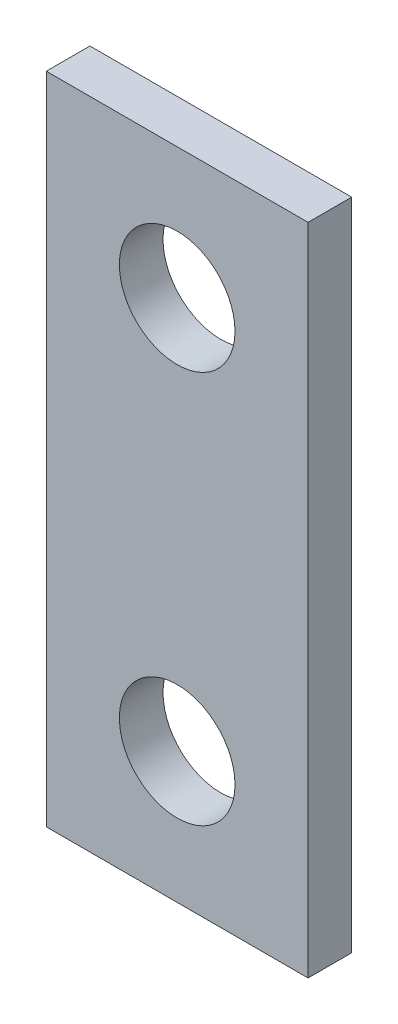
ISO-10303-21;
HEADER;
FILE_DESCRIPTION(('STEP AP214'),'2;1');
FILE_NAME('part.step','',(''),(''),'','','');
FILE_SCHEMA(('AUTOMOTIVE_DESIGN { 1 0 10303 214 1 1 1 1 }'));
ENDSEC;
DATA;
#1=APPLICATION_CONTEXT('core data for automotive mechanical design processes');
#2=APPLICATION_PROTOCOL_DEFINITION('international standard','automotive_design',2000,#1);
#3=PRODUCT_CONTEXT('',#1,'mechanical');
#4=PRODUCT('Part','Part','',(#3));
#5=PRODUCT_RELATED_PRODUCT_CATEGORY('part','',(#4));
#6=PRODUCT_DEFINITION_FORMATION('','',#4);
#7=PRODUCT_DEFINITION_CONTEXT('part definition',#1,'design');
#8=PRODUCT_DEFINITION('design','',#6,#7);
#9=PRODUCT_DEFINITION_SHAPE('','',#8);
#10=(LENGTH_UNIT() NAMED_UNIT(*) SI_UNIT(.MILLI.,.METRE.));
#11=(NAMED_UNIT(*) PLANE_ANGLE_UNIT() SI_UNIT($,.RADIAN.));
#12=(NAMED_UNIT(*) SI_UNIT($,.STERADIAN.) SOLID_ANGLE_UNIT());
#13=UNCERTAINTY_MEASURE_WITH_UNIT(LENGTH_MEASURE(1.E-05),#10,'distance_accuracy_value','');
#14=(GEOMETRIC_REPRESENTATION_CONTEXT(3) GLOBAL_UNCERTAINTY_ASSIGNED_CONTEXT((#13)) GLOBAL_UNIT_ASSIGNED_CONTEXT((#10,
#11,#12)) REPRESENTATION_CONTEXT('',''));
#15=CARTESIAN_POINT('',(0.,0.,0.));
#16=DIRECTION('',(0.,0.,1.));
#17=DIRECTION('',(1.,0.,0.));
#18=AXIS2_PLACEMENT_3D('',#15,#16,#17);
#19=CARTESIAN_POINT('',(5.99999999999999,-15.,1.99999999999995));
#20=DIRECTION('',(-1.,0.,0.));
#21=DIRECTION('',(0.,0.,1.));
#22=AXIS2_PLACEMENT_3D('',#19,#20,#21);
#23=PLANE('',#22);
#24=DIRECTION('',(0.,1.,0.));
#25=VECTOR('',#24,1.);
#26=CARTESIAN_POINT('',(5.99999999999999,-15.,0.));
#27=LINE('',#26,#25);
#28=CARTESIAN_POINT('',(5.99999999999999,-15.,0.));
#29=VERTEX_POINT('',#28);
#30=CARTESIAN_POINT('',(5.99999999999999,15.,0.));
#31=VERTEX_POINT('',#30);
#32=EDGE_CURVE('E121',#29,#31,#27,.T.);
#33=ORIENTED_EDGE('',*,*,#32,.T.);
#34=DIRECTION('',(0.,0.,-1.));
#35=VECTOR('',#34,1.);
#36=CARTESIAN_POINT('',(5.99999999999999,15.,1.99999999999995));
#37=LINE('',#36,#35);
#38=CARTESIAN_POINT('',(5.99999999999999,15.,1.99999999999995));
#39=VERTEX_POINT('',#38);
#40=EDGE_CURVE('E11',#39,#31,#37,.T.);
#41=ORIENTED_EDGE('',*,*,#40,.F.);
#42=DIRECTION('',(0.,1.,0.));
#43=VECTOR('',#42,1.);
#44=CARTESIAN_POINT('',(5.99999999999999,-15.,1.99999999999995));
#45=LINE('',#44,#43);
#46=CARTESIAN_POINT('',(5.99999999999999,-15.,1.99999999999995));
#47=VERTEX_POINT('',#46);
#48=EDGE_CURVE('E104',#47,#39,#45,.T.);
#49=ORIENTED_EDGE('',*,*,#48,.F.);
#50=DIRECTION('',(0.,0.,-1.));
#51=VECTOR('',#50,1.);
#52=CARTESIAN_POINT('',(5.99999999999999,-15.,1.99999999999995));
#53=LINE('',#52,#51);
#54=EDGE_CURVE('E117',#47,#29,#53,.T.);
#55=ORIENTED_EDGE('',*,*,#54,.T.);
#56=EDGE_LOOP('',(#33,#41,#49,#55));
#57=FACE_BOUND('',#56,.T.);
#58=ADVANCED_FACE('F44',(#57),#23,.F.);
#59=CARTESIAN_POINT('',(-6.00000000000001,15.,1.99999999999995));
#60=DIRECTION('',(0.,-1.,0.));
#61=DIRECTION('',(0.,0.,-1.));
#62=AXIS2_PLACEMENT_3D('',#59,#60,#61);
#63=PLANE('',#62);
#64=DIRECTION('',(-1.,0.,0.));
#65=VECTOR('',#64,1.);
#66=CARTESIAN_POINT('',(-6.00000000000001,15.,0.));
#67=LINE('',#66,#65);
#68=CARTESIAN_POINT('',(-6.00000000000001,15.,0.));
#69=VERTEX_POINT('',#68);
#70=EDGE_CURVE('E109',#31,#69,#67,.T.);
#71=ORIENTED_EDGE('',*,*,#70,.T.);
#72=DIRECTION('',(0.,0.,-1.));
#73=VECTOR('',#72,1.);
#74=CARTESIAN_POINT('',(-6.00000000000001,15.,1.99999999999995));
#75=LINE('',#74,#73);
#76=CARTESIAN_POINT('',(-6.00000000000001,15.,1.99999999999995));
#77=VERTEX_POINT('',#76);
#78=EDGE_CURVE('E53',#77,#69,#75,.T.);
#79=ORIENTED_EDGE('',*,*,#78,.F.);
#80=DIRECTION('',(-1.,0.,0.));
#81=VECTOR('',#80,1.);
#82=CARTESIAN_POINT('',(-6.00000000000001,15.,1.99999999999995));
#83=LINE('',#82,#81);
#84=EDGE_CURVE('E99',#39,#77,#83,.T.);
#85=ORIENTED_EDGE('',*,*,#84,.F.);
#86=ORIENTED_EDGE('',*,*,#40,.T.);
#87=EDGE_LOOP('',(#71,#79,#85,#86));
#88=FACE_BOUND('',#87,.T.);
#89=ADVANCED_FACE('F108',(#88),#63,.F.);
#90=CARTESIAN_POINT('',(-6.,-15.,1.99999999999995));
#91=DIRECTION('',(1.,0.,0.));
#92=DIRECTION('',(0.,0.,-1.));
#93=AXIS2_PLACEMENT_3D('',#90,#91,#92);
#94=PLANE('',#93);
#95=DIRECTION('',(0.,-1.,0.));
#96=VECTOR('',#95,1.);
#97=CARTESIAN_POINT('',(-6.,-15.,0.));
#98=LINE('',#97,#96);
#99=CARTESIAN_POINT('',(-6.,-15.,0.));
#100=VERTEX_POINT('',#99);
#101=EDGE_CURVE('E84',#69,#100,#98,.T.);
#102=ORIENTED_EDGE('',*,*,#101,.T.);
#103=DIRECTION('',(0.,0.,-1.));
#104=VECTOR('',#103,1.);
#105=CARTESIAN_POINT('',(-6.,-15.,1.99999999999995));
#106=LINE('',#105,#104);
#107=CARTESIAN_POINT('',(-6.,-15.,1.99999999999995));
#108=VERTEX_POINT('',#107);
#109=EDGE_CURVE('E111',#108,#100,#106,.T.);
#110=ORIENTED_EDGE('',*,*,#109,.F.);
#111=DIRECTION('',(0.,-1.,0.));
#112=VECTOR('',#111,1.);
#113=CARTESIAN_POINT('',(-6.,-15.,1.99999999999995));
#114=LINE('',#113,#112);
#115=EDGE_CURVE('E102',#77,#108,#114,.T.);
#116=ORIENTED_EDGE('',*,*,#115,.F.);
#117=ORIENTED_EDGE('',*,*,#78,.T.);
#118=EDGE_LOOP('',(#102,#110,#116,#117));
#119=FACE_BOUND('',#118,.T.);
#120=ADVANCED_FACE('F112',(#119),#94,.F.);
#121=CARTESIAN_POINT('',(-6.,-15.,1.99999999999995));
#122=DIRECTION('',(0.,1.,0.));
#123=DIRECTION('',(0.,0.,1.));
#124=AXIS2_PLACEMENT_3D('',#121,#122,#123);
#125=PLANE('',#124);
#126=DIRECTION('',(1.,0.,0.));
#127=VECTOR('',#126,1.);
#128=CARTESIAN_POINT('',(-6.,-15.,0.));
#129=LINE('',#128,#127);
#130=EDGE_CURVE('E91',#100,#29,#129,.T.);
#131=ORIENTED_EDGE('',*,*,#130,.T.);
#132=ORIENTED_EDGE('',*,*,#54,.F.);
#133=DIRECTION('',(1.,0.,0.));
#134=VECTOR('',#133,1.);
#135=CARTESIAN_POINT('',(-6.,-15.,1.99999999999995));
#136=LINE('',#135,#134);
#137=EDGE_CURVE('E64',#108,#47,#136,.T.);
#138=ORIENTED_EDGE('',*,*,#137,.F.);
#139=ORIENTED_EDGE('',*,*,#109,.T.);
#140=EDGE_LOOP('',(#131,#132,#138,#139));
#141=FACE_BOUND('',#140,.T.);
#142=ADVANCED_FACE('F134',(#141),#125,.F.);
#143=CARTESIAN_POINT('',(0.,0.,2.));
#144=DIRECTION('',(0.,0.,-1.));
#145=DIRECTION('',(-1.,0.,0.));
#146=AXIS2_PLACEMENT_3D('',#143,#144,#145);
#147=PLANE('',#146);
#148=CARTESIAN_POINT('',(0.,-8.99999999999994,1.99999999999995));
#149=DIRECTION('',(0.,0.,1.));
#150=DIRECTION('',(1.,0.,0.));
#151=AXIS2_PLACEMENT_3D('',#148,#149,#150);
#152=CIRCLE('',#151,2.65);
#153=CARTESIAN_POINT('',(2.65,-8.99999999999994,1.99999999999995));
#154=VERTEX_POINT('',#153);
#155=EDGE_CURVE('E152',#154,#154,#152,.T.);
#156=ORIENTED_EDGE('',*,*,#155,.F.);
#157=EDGE_LOOP('',(#156));
#158=FACE_BOUND('',#157,.T.);
#159=CARTESIAN_POINT('',(0.,9.00000000000001,1.99999999999995));
#160=DIRECTION('',(0.,0.,1.));
#161=DIRECTION('',(1.,0.,0.));
#162=AXIS2_PLACEMENT_3D('',#159,#160,#161);
#163=CIRCLE('',#162,2.65);
#164=CARTESIAN_POINT('',(2.65,9.00000000000001,1.99999999999995));
#165=VERTEX_POINT('',#164);
#166=EDGE_CURVE('E144',#165,#165,#163,.T.);
#167=ORIENTED_EDGE('',*,*,#166,.F.);
#168=EDGE_LOOP('',(#167));
#169=FACE_BOUND('',#168,.T.);
#170=ORIENTED_EDGE('',*,*,#48,.T.);
#171=ORIENTED_EDGE('',*,*,#84,.T.);
#172=ORIENTED_EDGE('',*,*,#115,.T.);
#173=ORIENTED_EDGE('',*,*,#137,.T.);
#174=EDGE_LOOP('',(#170,#171,#172,#173));
#175=FACE_BOUND('',#174,.T.);
#176=ADVANCED_FACE('F100',(#158,#169,#175),#147,.F.);
#177=CARTESIAN_POINT('',(0.,0.,0.));
#178=DIRECTION('',(0.,0.,-1.));
#179=DIRECTION('',(-1.,0.,0.));
#180=AXIS2_PLACEMENT_3D('',#177,#178,#179);
#181=PLANE('',#180);
#182=CARTESIAN_POINT('',(0.,-9.00000000000001,0.));
#183=DIRECTION('',(0.,0.,-1.));
#184=DIRECTION('',(-1.,0.,0.));
#185=AXIS2_PLACEMENT_3D('',#182,#183,#184);
#186=CIRCLE('',#185,2.65);
#187=CARTESIAN_POINT('',(-2.65,-9.00000000000001,0.));
#188=VERTEX_POINT('',#187);
#189=EDGE_CURVE('E148',#188,#188,#186,.T.);
#190=ORIENTED_EDGE('',*,*,#189,.F.);
#191=EDGE_LOOP('',(#190));
#192=FACE_BOUND('',#191,.T.);
#193=CARTESIAN_POINT('',(0.,9.00000000000004,0.));
#194=DIRECTION('',(0.,0.,-1.));
#195=DIRECTION('',(-1.,0.,0.));
#196=AXIS2_PLACEMENT_3D('',#193,#194,#195);
#197=CIRCLE('',#196,2.65);
#198=CARTESIAN_POINT('',(-2.65,9.00000000000004,0.));
#199=VERTEX_POINT('',#198);
#200=EDGE_CURVE('E125',#199,#199,#197,.T.);
#201=ORIENTED_EDGE('',*,*,#200,.F.);
#202=EDGE_LOOP('',(#201));
#203=FACE_BOUND('',#202,.T.);
#204=ORIENTED_EDGE('',*,*,#32,.F.);
#205=ORIENTED_EDGE('',*,*,#130,.F.);
#206=ORIENTED_EDGE('',*,*,#101,.F.);
#207=ORIENTED_EDGE('',*,*,#70,.F.);
#208=EDGE_LOOP('',(#204,#205,#206,#207));
#209=FACE_BOUND('',#208,.T.);
#210=ADVANCED_FACE('F137',(#192,#203,#209),#181,.T.);
#211=CARTESIAN_POINT('',(0.,9.00000000000001,1.99999999999995));
#212=DIRECTION('',(0.,0.,1.));
#213=DIRECTION('',(1.,0.,0.));
#214=AXIS2_PLACEMENT_3D('',#211,#212,#213);
#215=CYLINDRICAL_SURFACE('',#214,2.65);
#216=ORIENTED_EDGE('',*,*,#166,.T.);
#217=EDGE_LOOP('',(#216));
#218=FACE_BOUND('',#217,.T.);
#219=ORIENTED_EDGE('',*,*,#200,.T.);
#220=EDGE_LOOP('',(#219));
#221=FACE_BOUND('',#220,.T.);
#222=ADVANCED_FACE('F165',(#218,#221),#215,.F.);
#223=CARTESIAN_POINT('',(0.,-8.99999999999994,1.99999999999995));
#224=DIRECTION('',(0.,0.,1.));
#225=DIRECTION('',(1.,0.,0.));
#226=AXIS2_PLACEMENT_3D('',#223,#224,#225);
#227=CYLINDRICAL_SURFACE('',#226,2.65);
#228=ORIENTED_EDGE('',*,*,#155,.T.);
#229=EDGE_LOOP('',(#228));
#230=FACE_BOUND('',#229,.T.);
#231=ORIENTED_EDGE('',*,*,#189,.T.);
#232=EDGE_LOOP('',(#231));
#233=FACE_BOUND('',#232,.T.);
#234=ADVANCED_FACE('F157',(#230,#233),#227,.F.);
#235=CLOSED_SHELL('',(#58,#89,#120,#142,#176,#210,#222,#234));
#236=MANIFOLD_SOLID_BREP('B2',#235);
#237=ADVANCED_BREP_SHAPE_REPRESENTATION('',(#18,#236),#14);
#238=SHAPE_DEFINITION_REPRESENTATION(#9,#237);
ENDSEC;
END-ISO-10303-21;
